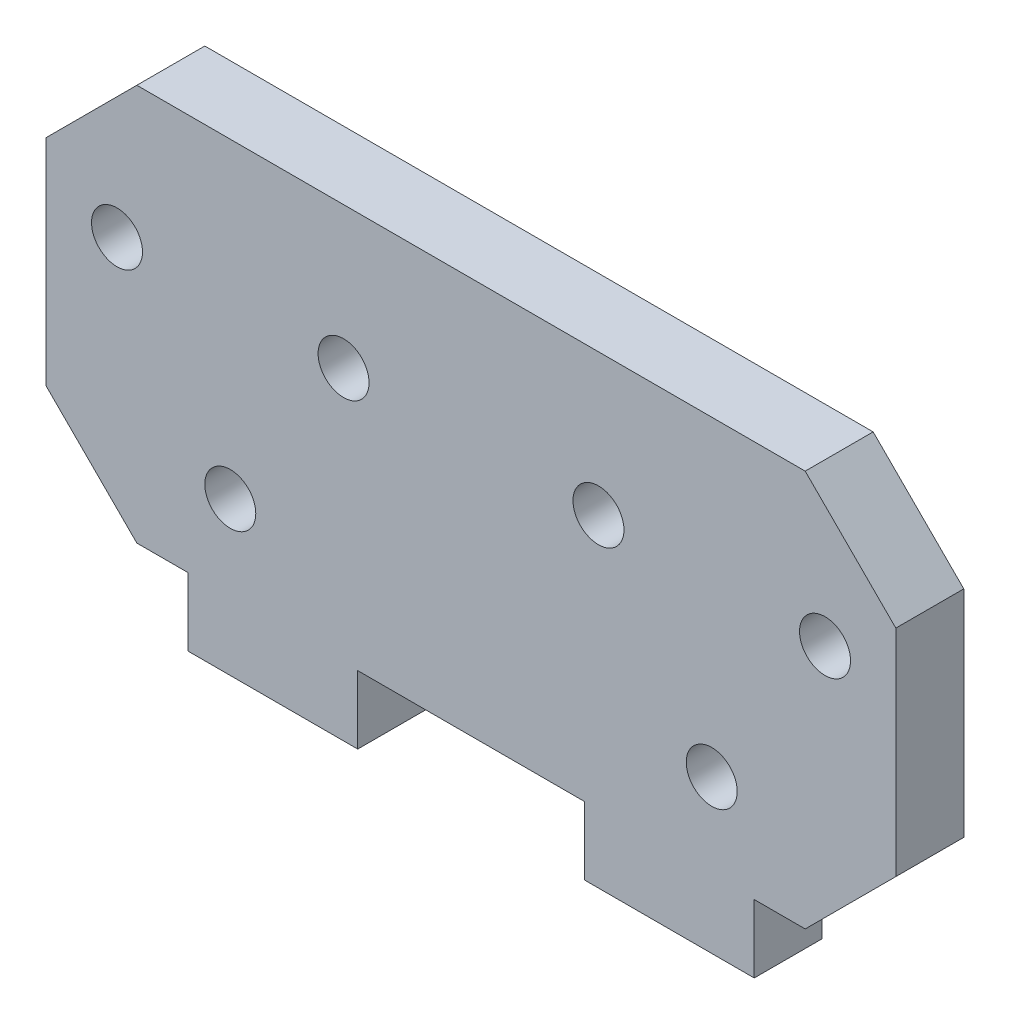
ISO-10303-21;
HEADER;
FILE_DESCRIPTION(('STEP AP214'),'2;1');
FILE_NAME('part.step','',(''),(''),'','','');
FILE_SCHEMA(('AUTOMOTIVE_DESIGN { 1 0 10303 214 1 1 1 1 }'));
ENDSEC;
DATA;
#1=APPLICATION_CONTEXT('core data for automotive mechanical design processes');
#2=APPLICATION_PROTOCOL_DEFINITION('international standard','automotive_design',2000,#1);
#3=PRODUCT_CONTEXT('',#1,'mechanical');
#4=PRODUCT('Part','Part','',(#3));
#5=PRODUCT_RELATED_PRODUCT_CATEGORY('part','',(#4));
#6=PRODUCT_DEFINITION_FORMATION('','',#4);
#7=PRODUCT_DEFINITION_CONTEXT('part definition',#1,'design');
#8=PRODUCT_DEFINITION('design','',#6,#7);
#9=PRODUCT_DEFINITION_SHAPE('','',#8);
#10=(LENGTH_UNIT() NAMED_UNIT(*) SI_UNIT(.MILLI.,.METRE.));
#11=(NAMED_UNIT(*) PLANE_ANGLE_UNIT() SI_UNIT($,.RADIAN.));
#12=(NAMED_UNIT(*) SI_UNIT($,.STERADIAN.) SOLID_ANGLE_UNIT());
#13=UNCERTAINTY_MEASURE_WITH_UNIT(LENGTH_MEASURE(1.E-05),#10,'distance_accuracy_value','');
#14=(GEOMETRIC_REPRESENTATION_CONTEXT(3) GLOBAL_UNCERTAINTY_ASSIGNED_CONTEXT((#13)) GLOBAL_UNIT_ASSIGNED_CONTEXT((#10,
#11,#12)) REPRESENTATION_CONTEXT('',''));
#15=CARTESIAN_POINT('',(0.,0.,0.));
#16=DIRECTION('',(0.,0.,1.));
#17=DIRECTION('',(1.,0.,0.));
#18=AXIS2_PLACEMENT_3D('',#15,#16,#17);
#19=CARTESIAN_POINT('',(-37.5,-17.5,3.));
#20=DIRECTION('',(0.,1.,0.));
#21=DIRECTION('',(-1.,0.,0.));
#22=AXIS2_PLACEMENT_3D('',#19,#20,#21);
#23=PLANE('',#22);
#24=DIRECTION('',(1.,0.,0.));
#25=VECTOR('',#24,1.);
#26=CARTESIAN_POINT('',(-37.5,-17.5,-3.));
#27=LINE('',#26,#25);
#28=CARTESIAN_POINT('',(-10.,-17.5,-3.));
#29=VERTEX_POINT('',#28);
#30=CARTESIAN_POINT('',(10.,-17.5,-3.));
#31=VERTEX_POINT('',#30);
#32=EDGE_CURVE('E269',#29,#31,#27,.T.);
#33=ORIENTED_EDGE('',*,*,#32,.T.);
#34=DIRECTION('',(0.,0.,1.));
#35=VECTOR('',#34,1.);
#36=CARTESIAN_POINT('',(10.,-17.5,-3.));
#37=LINE('',#36,#35);
#38=CARTESIAN_POINT('',(10.,-17.5,3.));
#39=VERTEX_POINT('',#38);
#40=EDGE_CURVE('E171',#31,#39,#37,.T.);
#41=ORIENTED_EDGE('',*,*,#40,.T.);
#42=DIRECTION('',(1.,0.,0.));
#43=VECTOR('',#42,1.);
#44=CARTESIAN_POINT('',(-37.5,-17.5,3.));
#45=LINE('',#44,#43);
#46=CARTESIAN_POINT('',(-10.,-17.5,3.));
#47=VERTEX_POINT('',#46);
#48=EDGE_CURVE('E256',#47,#39,#45,.T.);
#49=ORIENTED_EDGE('',*,*,#48,.F.);
#50=DIRECTION('',(0.,0.,1.));
#51=VECTOR('',#50,1.);
#52=CARTESIAN_POINT('',(-10.,-17.5,-3.));
#53=LINE('',#52,#51);
#54=EDGE_CURVE('E208',#29,#47,#53,.T.);
#55=ORIENTED_EDGE('',*,*,#54,.F.);
#56=EDGE_LOOP('',(#33,#41,#49,#55));
#57=FACE_BOUND('',#56,.T.);
#58=ADVANCED_FACE('F32',(#57),#23,.F.);
#59=CARTESIAN_POINT('',(25.,-17.5,-3.));
#60=VERTEX_POINT('',#59);
#61=CARTESIAN_POINT('',(29.5,-17.5,-3.));
#62=VERTEX_POINT('',#61);
#63=EDGE_CURVE('E265',#60,#62,#27,.T.);
#64=ORIENTED_EDGE('',*,*,#63,.T.);
#65=DIRECTION('',(0.,0.,1.));
#66=VECTOR('',#65,1.);
#67=CARTESIAN_POINT('',(29.5,-17.5,3.));
#68=LINE('',#67,#66);
#69=CARTESIAN_POINT('',(29.5,-17.5,3.));
#70=VERTEX_POINT('',#69);
#71=EDGE_CURVE('E47',#62,#70,#68,.T.);
#72=ORIENTED_EDGE('',*,*,#71,.T.);
#73=CARTESIAN_POINT('',(25.,-17.5,3.));
#74=VERTEX_POINT('',#73);
#75=EDGE_CURVE('E251',#74,#70,#45,.T.);
#76=ORIENTED_EDGE('',*,*,#75,.F.);
#77=DIRECTION('',(0.,0.,1.));
#78=VECTOR('',#77,1.);
#79=CARTESIAN_POINT('',(25.,-17.5,-3.));
#80=LINE('',#79,#78);
#81=EDGE_CURVE('E183',#60,#74,#80,.T.);
#82=ORIENTED_EDGE('',*,*,#81,.F.);
#83=EDGE_LOOP('',(#64,#72,#76,#82));
#84=FACE_BOUND('',#83,.T.);
#85=ADVANCED_FACE('F357',(#84),#23,.F.);
#86=CARTESIAN_POINT('',(0.,0.,3.));
#87=DIRECTION('',(0.,0.,1.));
#88=DIRECTION('',(1.,0.,0.));
#89=AXIS2_PLACEMENT_3D('',#86,#87,#88);
#90=PLANE('',#89);
#91=CARTESIAN_POINT('',(-31.25,5.,3.));
#92=DIRECTION('',(0.,0.,1.));
#93=DIRECTION('',(1.,0.,0.));
#94=AXIS2_PLACEMENT_3D('',#91,#92,#93);
#95=CIRCLE('',#94,2.24999999999999);
#96=CARTESIAN_POINT('',(-29.,5.,3.));
#97=VERTEX_POINT('',#96);
#98=EDGE_CURVE('E207',#97,#97,#95,.T.);
#99=ORIENTED_EDGE('',*,*,#98,.F.);
#100=EDGE_LOOP('',(#99));
#101=FACE_BOUND('',#100,.T.);
#102=CARTESIAN_POINT('',(31.25,5.,3.));
#103=DIRECTION('',(0.,0.,1.));
#104=DIRECTION('',(1.,0.,0.));
#105=AXIS2_PLACEMENT_3D('',#102,#103,#104);
#106=CIRCLE('',#105,2.24999999999999);
#107=CARTESIAN_POINT('',(33.5,5.,3.));
#108=VERTEX_POINT('',#107);
#109=EDGE_CURVE('E218',#108,#108,#106,.T.);
#110=ORIENTED_EDGE('',*,*,#109,.F.);
#111=EDGE_LOOP('',(#110));
#112=FACE_BOUND('',#111,.T.);
#113=CARTESIAN_POINT('',(11.25,5.,3.));
#114=DIRECTION('',(0.,0.,1.));
#115=DIRECTION('',(1.,0.,0.));
#116=AXIS2_PLACEMENT_3D('',#113,#114,#115);
#117=CIRCLE('',#116,2.24999999999999);
#118=CARTESIAN_POINT('',(13.5,5.,3.));
#119=VERTEX_POINT('',#118);
#120=EDGE_CURVE('E224',#119,#119,#117,.T.);
#121=ORIENTED_EDGE('',*,*,#120,.F.);
#122=EDGE_LOOP('',(#121));
#123=FACE_BOUND('',#122,.T.);
#124=CARTESIAN_POINT('',(-21.25,-10.,3.));
#125=DIRECTION('',(0.,0.,1.));
#126=DIRECTION('',(1.,0.,0.));
#127=AXIS2_PLACEMENT_3D('',#124,#125,#126);
#128=CIRCLE('',#127,2.24999999999999);
#129=CARTESIAN_POINT('',(-19.,-10.,3.));
#130=VERTEX_POINT('',#129);
#131=EDGE_CURVE('E230',#130,#130,#128,.T.);
#132=ORIENTED_EDGE('',*,*,#131,.F.);
#133=EDGE_LOOP('',(#132));
#134=FACE_BOUND('',#133,.T.);
#135=CARTESIAN_POINT('',(21.25,-10.,3.));
#136=DIRECTION('',(0.,0.,1.));
#137=DIRECTION('',(1.,0.,0.));
#138=AXIS2_PLACEMENT_3D('',#135,#136,#137);
#139=CIRCLE('',#138,2.24999999999999);
#140=CARTESIAN_POINT('',(23.5,-10.,3.));
#141=VERTEX_POINT('',#140);
#142=EDGE_CURVE('E236',#141,#141,#139,.T.);
#143=ORIENTED_EDGE('',*,*,#142,.F.);
#144=EDGE_LOOP('',(#143));
#145=FACE_BOUND('',#144,.T.);
#146=DIRECTION('',(0.,1.,0.));
#147=VECTOR('',#146,1.);
#148=CARTESIAN_POINT('',(37.5,17.5,3.));
#149=LINE('',#148,#147);
#150=CARTESIAN_POINT('',(37.5,-9.50000000000001,3.));
#151=VERTEX_POINT('',#150);
#152=CARTESIAN_POINT('',(37.5,9.49999999999997,3.));
#153=VERTEX_POINT('',#152);
#154=EDGE_CURVE('E255',#151,#153,#149,.T.);
#155=ORIENTED_EDGE('',*,*,#154,.T.);
#156=DIRECTION('',(0.707106781186546,-0.707106781186549,0.));
#157=VECTOR('',#156,1.);
#158=CARTESIAN_POINT('',(23.5000000000001,23.5,3.));
#159=LINE('',#158,#157);
#160=CARTESIAN_POINT('',(29.5,17.5,3.));
#161=VERTEX_POINT('',#160);
#162=EDGE_CURVE('E296',#153,#161,#159,.F.);
#163=ORIENTED_EDGE('',*,*,#162,.T.);
#164=DIRECTION('',(-1.,0.,0.));
#165=VECTOR('',#164,1.);
#166=CARTESIAN_POINT('',(-37.5,17.5,3.));
#167=LINE('',#166,#165);
#168=CARTESIAN_POINT('',(-29.5,17.5,3.));
#169=VERTEX_POINT('',#168);
#170=EDGE_CURVE('E259',#161,#169,#167,.T.);
#171=ORIENTED_EDGE('',*,*,#170,.T.);
#172=DIRECTION('',(0.707106781186549,0.707106781186546,0.));
#173=VECTOR('',#172,1.);
#174=CARTESIAN_POINT('',(-23.4999999999999,23.5,3.));
#175=LINE('',#174,#173);
#176=CARTESIAN_POINT('',(-37.5,9.50000000000001,3.));
#177=VERTEX_POINT('',#176);
#178=EDGE_CURVE('E291',#169,#177,#175,.F.);
#179=ORIENTED_EDGE('',*,*,#178,.T.);
#180=DIRECTION('',(0.,-1.,0.));
#181=VECTOR('',#180,1.);
#182=CARTESIAN_POINT('',(-37.5,17.5,3.));
#183=LINE('',#182,#181);
#184=CARTESIAN_POINT('',(-37.5,-9.49999999999999,3.));
#185=VERTEX_POINT('',#184);
#186=EDGE_CURVE('E249',#177,#185,#183,.T.);
#187=ORIENTED_EDGE('',*,*,#186,.T.);
#188=DIRECTION('',(-0.707106781186546,0.707106781186549,0.));
#189=VECTOR('',#188,1.);
#190=CARTESIAN_POINT('',(-23.5000000000001,-23.5,3.));
#191=LINE('',#190,#189);
#192=CARTESIAN_POINT('',(-29.5,-17.5,3.));
#193=VERTEX_POINT('',#192);
#194=EDGE_CURVE('E55',#185,#193,#191,.F.);
#195=ORIENTED_EDGE('',*,*,#194,.T.);
#196=CARTESIAN_POINT('',(-25.,-17.5,3.));
#197=VERTEX_POINT('',#196);
#198=EDGE_CURVE('E253',#193,#197,#45,.T.);
#199=ORIENTED_EDGE('',*,*,#198,.T.);
#200=DIRECTION('',(0.,-1.,0.));
#201=VECTOR('',#200,1.);
#202=CARTESIAN_POINT('',(-25.,-17.5,3.));
#203=LINE('',#202,#201);
#204=CARTESIAN_POINT('',(-25.,-23.5,3.));
#205=VERTEX_POINT('',#204);
#206=EDGE_CURVE('E182',#197,#205,#203,.T.);
#207=ORIENTED_EDGE('',*,*,#206,.T.);
#208=DIRECTION('',(1.,0.,0.));
#209=VECTOR('',#208,1.);
#210=CARTESIAN_POINT('',(-25.,-23.5,3.));
#211=LINE('',#210,#209);
#212=CARTESIAN_POINT('',(-10.,-23.5,3.));
#213=VERTEX_POINT('',#212);
#214=EDGE_CURVE('E199',#205,#213,#211,.T.);
#215=ORIENTED_EDGE('',*,*,#214,.T.);
#216=DIRECTION('',(0.,1.,0.));
#217=VECTOR('',#216,1.);
#218=CARTESIAN_POINT('',(-10.,-17.5,3.));
#219=LINE('',#218,#217);
#220=EDGE_CURVE('E191',#213,#47,#219,.T.);
#221=ORIENTED_EDGE('',*,*,#220,.T.);
#222=ORIENTED_EDGE('',*,*,#48,.T.);
#223=DIRECTION('',(0.,-1.,0.));
#224=VECTOR('',#223,1.);
#225=CARTESIAN_POINT('',(10.,-17.5,3.));
#226=LINE('',#225,#224);
#227=CARTESIAN_POINT('',(10.,-23.5,3.));
#228=VERTEX_POINT('',#227);
#229=EDGE_CURVE('E178',#39,#228,#226,.T.);
#230=ORIENTED_EDGE('',*,*,#229,.T.);
#231=DIRECTION('',(1.,0.,0.));
#232=VECTOR('',#231,1.);
#233=CARTESIAN_POINT('',(10.,-23.5,3.));
#234=LINE('',#233,#232);
#235=CARTESIAN_POINT('',(25.,-23.5,3.));
#236=VERTEX_POINT('',#235);
#237=EDGE_CURVE('E151',#228,#236,#234,.T.);
#238=ORIENTED_EDGE('',*,*,#237,.T.);
#239=DIRECTION('',(0.,1.,0.));
#240=VECTOR('',#239,1.);
#241=CARTESIAN_POINT('',(25.,-17.5,3.));
#242=LINE('',#241,#240);
#243=EDGE_CURVE('E172',#236,#74,#242,.T.);
#244=ORIENTED_EDGE('',*,*,#243,.T.);
#245=ORIENTED_EDGE('',*,*,#75,.T.);
#246=DIRECTION('',(-0.707106781186549,-0.707106781186546,0.));
#247=VECTOR('',#246,1.);
#248=CARTESIAN_POINT('',(23.4999999999999,-23.5,3.));
#249=LINE('',#248,#247);
#250=EDGE_CURVE('E294',#70,#151,#249,.F.);
#251=ORIENTED_EDGE('',*,*,#250,.T.);
#252=EDGE_LOOP('',(#155,#163,#171,#179,#187,#195,#199,#207,#215,#221,#222,#230,#238,#244,#245,#251));
#253=FACE_BOUND('',#252,.T.);
#254=CARTESIAN_POINT('',(-11.25,5.,3.));
#255=DIRECTION('',(0.,0.,1.));
#256=DIRECTION('',(1.,0.,0.));
#257=AXIS2_PLACEMENT_3D('',#254,#255,#256);
#258=CIRCLE('',#257,2.25);
#259=CARTESIAN_POINT('',(-9.,5.,3.));
#260=VERTEX_POINT('',#259);
#261=EDGE_CURVE('E243',#260,#260,#258,.T.);
#262=ORIENTED_EDGE('',*,*,#261,.F.);
#263=EDGE_LOOP('',(#262));
#264=FACE_BOUND('',#263,.T.);
#265=ADVANCED_FACE('F319',(#101,#112,#123,#134,#145,#253,#264),#90,.T.);
#266=CARTESIAN_POINT('',(0.,0.,-3.));
#267=DIRECTION('',(0.,0.,1.));
#268=DIRECTION('',(1.,0.,0.));
#269=AXIS2_PLACEMENT_3D('',#266,#267,#268);
#270=PLANE('',#269);
#271=CARTESIAN_POINT('',(-31.25,5.,-3.));
#272=DIRECTION('',(0.,0.,1.));
#273=DIRECTION('',(1.,0.,0.));
#274=AXIS2_PLACEMENT_3D('',#271,#272,#273);
#275=CIRCLE('',#274,2.24999999999999);
#276=CARTESIAN_POINT('',(-29.,5.,-3.));
#277=VERTEX_POINT('',#276);
#278=EDGE_CURVE('E215',#277,#277,#275,.T.);
#279=ORIENTED_EDGE('',*,*,#278,.T.);
#280=EDGE_LOOP('',(#279));
#281=FACE_BOUND('',#280,.T.);
#282=CARTESIAN_POINT('',(31.25,5.,-3.));
#283=DIRECTION('',(0.,0.,1.));
#284=DIRECTION('',(1.,0.,0.));
#285=AXIS2_PLACEMENT_3D('',#282,#283,#284);
#286=CIRCLE('',#285,2.25);
#287=CARTESIAN_POINT('',(33.5,5.,-3.));
#288=VERTEX_POINT('',#287);
#289=EDGE_CURVE('E221',#288,#288,#286,.T.);
#290=ORIENTED_EDGE('',*,*,#289,.T.);
#291=EDGE_LOOP('',(#290));
#292=FACE_BOUND('',#291,.T.);
#293=CARTESIAN_POINT('',(11.25,5.,-3.));
#294=DIRECTION('',(0.,0.,1.));
#295=DIRECTION('',(1.,0.,0.));
#296=AXIS2_PLACEMENT_3D('',#293,#294,#295);
#297=CIRCLE('',#296,2.24999999999999);
#298=CARTESIAN_POINT('',(13.5,5.,-3.));
#299=VERTEX_POINT('',#298);
#300=EDGE_CURVE('E227',#299,#299,#297,.T.);
#301=ORIENTED_EDGE('',*,*,#300,.T.);
#302=EDGE_LOOP('',(#301));
#303=FACE_BOUND('',#302,.T.);
#304=CARTESIAN_POINT('',(-21.25,-10.,-3.));
#305=DIRECTION('',(0.,0.,1.));
#306=DIRECTION('',(1.,0.,0.));
#307=AXIS2_PLACEMENT_3D('',#304,#305,#306);
#308=CIRCLE('',#307,2.24999999999999);
#309=CARTESIAN_POINT('',(-19.,-10.,-3.));
#310=VERTEX_POINT('',#309);
#311=EDGE_CURVE('E233',#310,#310,#308,.T.);
#312=ORIENTED_EDGE('',*,*,#311,.T.);
#313=EDGE_LOOP('',(#312));
#314=FACE_BOUND('',#313,.T.);
#315=CARTESIAN_POINT('',(21.25,-10.,-3.));
#316=DIRECTION('',(0.,0.,1.));
#317=DIRECTION('',(1.,0.,0.));
#318=AXIS2_PLACEMENT_3D('',#315,#316,#317);
#319=CIRCLE('',#318,2.24999999999999);
#320=CARTESIAN_POINT('',(23.5,-10.,-3.));
#321=VERTEX_POINT('',#320);
#322=EDGE_CURVE('E239',#321,#321,#319,.T.);
#323=ORIENTED_EDGE('',*,*,#322,.T.);
#324=EDGE_LOOP('',(#323));
#325=FACE_BOUND('',#324,.T.);
#326=DIRECTION('',(-1.,0.,0.));
#327=VECTOR('',#326,1.);
#328=CARTESIAN_POINT('',(-37.5,17.5,-3.));
#329=LINE('',#328,#327);
#330=CARTESIAN_POINT('',(29.5,17.5,-3.));
#331=VERTEX_POINT('',#330);
#332=CARTESIAN_POINT('',(-29.5,17.5,-3.));
#333=VERTEX_POINT('',#332);
#334=EDGE_CURVE('E252',#331,#333,#329,.T.);
#335=ORIENTED_EDGE('',*,*,#334,.F.);
#336=DIRECTION('',(-0.707106781186546,0.707106781186549,0.));
#337=VECTOR('',#336,1.);
#338=CARTESIAN_POINT('',(29.5,17.5,-3.));
#339=LINE('',#338,#337);
#340=CARTESIAN_POINT('',(37.5,9.49999999999997,-3.));
#341=VERTEX_POINT('',#340);
#342=EDGE_CURVE('E284',#331,#341,#339,.F.);
#343=ORIENTED_EDGE('',*,*,#342,.T.);
#344=DIRECTION('',(0.,1.,0.));
#345=VECTOR('',#344,1.);
#346=CARTESIAN_POINT('',(37.5,17.5,-3.));
#347=LINE('',#346,#345);
#348=CARTESIAN_POINT('',(37.5,-9.50000000000001,-3.));
#349=VERTEX_POINT('',#348);
#350=EDGE_CURVE('E268',#349,#341,#347,.T.);
#351=ORIENTED_EDGE('',*,*,#350,.F.);
#352=DIRECTION('',(0.707106781186549,0.707106781186546,0.));
#353=VECTOR('',#352,1.);
#354=CARTESIAN_POINT('',(37.5,-9.50000000000001,-3.));
#355=LINE('',#354,#353);
#356=EDGE_CURVE('E282',#349,#62,#355,.F.);
#357=ORIENTED_EDGE('',*,*,#356,.T.);
#358=ORIENTED_EDGE('',*,*,#63,.F.);
#359=DIRECTION('',(0.,1.,0.));
#360=VECTOR('',#359,1.);
#361=CARTESIAN_POINT('',(25.,-17.5,-3.));
#362=LINE('',#361,#360);
#363=CARTESIAN_POINT('',(25.,-23.5,-3.));
#364=VERTEX_POINT('',#363);
#365=EDGE_CURVE('E157',#364,#60,#362,.T.);
#366=ORIENTED_EDGE('',*,*,#365,.F.);
#367=DIRECTION('',(1.,0.,0.));
#368=VECTOR('',#367,1.);
#369=CARTESIAN_POINT('',(10.,-23.5,-3.));
#370=LINE('',#369,#368);
#371=CARTESIAN_POINT('',(10.,-23.5,-3.));
#372=VERTEX_POINT('',#371);
#373=EDGE_CURVE('E149',#372,#364,#370,.T.);
#374=ORIENTED_EDGE('',*,*,#373,.F.);
#375=DIRECTION('',(0.,-1.,0.));
#376=VECTOR('',#375,1.);
#377=CARTESIAN_POINT('',(10.,-17.5,-3.));
#378=LINE('',#377,#376);
#379=EDGE_CURVE('E166',#31,#372,#378,.T.);
#380=ORIENTED_EDGE('',*,*,#379,.F.);
#381=ORIENTED_EDGE('',*,*,#32,.F.);
#382=DIRECTION('',(0.,1.,0.));
#383=VECTOR('',#382,1.);
#384=CARTESIAN_POINT('',(-10.,-17.5,-3.));
#385=LINE('',#384,#383);
#386=CARTESIAN_POINT('',(-10.,-23.5,-3.));
#387=VERTEX_POINT('',#386);
#388=EDGE_CURVE('E194',#387,#29,#385,.T.);
#389=ORIENTED_EDGE('',*,*,#388,.F.);
#390=DIRECTION('',(1.,0.,0.));
#391=VECTOR('',#390,1.);
#392=CARTESIAN_POINT('',(-25.,-23.5,-3.));
#393=LINE('',#392,#391);
#394=CARTESIAN_POINT('',(-25.,-23.5,-3.));
#395=VERTEX_POINT('',#394);
#396=EDGE_CURVE('E190',#395,#387,#393,.T.);
#397=ORIENTED_EDGE('',*,*,#396,.F.);
#398=DIRECTION('',(0.,-1.,0.));
#399=VECTOR('',#398,1.);
#400=CARTESIAN_POINT('',(-25.,-17.5,-3.));
#401=LINE('',#400,#399);
#402=CARTESIAN_POINT('',(-25.,-17.5,-3.));
#403=VERTEX_POINT('',#402);
#404=EDGE_CURVE('E187',#403,#395,#401,.T.);
#405=ORIENTED_EDGE('',*,*,#404,.F.);
#406=CARTESIAN_POINT('',(-29.5,-17.5,-3.));
#407=VERTEX_POINT('',#406);
#408=EDGE_CURVE('E266',#407,#403,#27,.T.);
#409=ORIENTED_EDGE('',*,*,#408,.F.);
#410=DIRECTION('',(0.707106781186546,-0.707106781186549,0.));
#411=VECTOR('',#410,1.);
#412=CARTESIAN_POINT('',(-29.5,-17.5,-3.));
#413=LINE('',#412,#411);
#414=CARTESIAN_POINT('',(-37.5,-9.49999999999999,-3.));
#415=VERTEX_POINT('',#414);
#416=EDGE_CURVE('E280',#407,#415,#413,.F.);
#417=ORIENTED_EDGE('',*,*,#416,.T.);
#418=DIRECTION('',(0.,-1.,0.));
#419=VECTOR('',#418,1.);
#420=CARTESIAN_POINT('',(-37.5,17.5,-3.));
#421=LINE('',#420,#419);
#422=CARTESIAN_POINT('',(-37.5,9.50000000000001,-3.));
#423=VERTEX_POINT('',#422);
#424=EDGE_CURVE('E246',#423,#415,#421,.T.);
#425=ORIENTED_EDGE('',*,*,#424,.F.);
#426=DIRECTION('',(-0.707106781186549,-0.707106781186546,0.));
#427=VECTOR('',#426,1.);
#428=CARTESIAN_POINT('',(-37.5,9.50000000000001,-3.));
#429=LINE('',#428,#427);
#430=EDGE_CURVE('E278',#423,#333,#429,.F.);
#431=ORIENTED_EDGE('',*,*,#430,.T.);
#432=EDGE_LOOP('',(#335,#343,#351,#357,#358,#366,#374,#380,#381,#389,#397,#405,#409,#417,#425,#431));
#433=FACE_BOUND('',#432,.T.);
#434=CARTESIAN_POINT('',(-11.25,5.,-3.));
#435=DIRECTION('',(0.,0.,1.));
#436=DIRECTION('',(1.,0.,0.));
#437=AXIS2_PLACEMENT_3D('',#434,#435,#436);
#438=CIRCLE('',#437,2.25);
#439=CARTESIAN_POINT('',(-9.,5.,-3.));
#440=VERTEX_POINT('',#439);
#441=EDGE_CURVE('E242',#440,#440,#438,.T.);
#442=ORIENTED_EDGE('',*,*,#441,.T.);
#443=EDGE_LOOP('',(#442));
#444=FACE_BOUND('',#443,.T.);
#445=ADVANCED_FACE('F163',(#281,#292,#303,#314,#325,#433,#444),#270,.F.);
#446=CARTESIAN_POINT('',(-37.5,17.5,3.));
#447=DIRECTION('',(1.,0.,0.));
#448=DIRECTION('',(0.,0.,-1.));
#449=AXIS2_PLACEMENT_3D('',#446,#447,#448);
#450=PLANE('',#449);
#451=ORIENTED_EDGE('',*,*,#424,.T.);
#452=DIRECTION('',(0.,0.,1.));
#453=VECTOR('',#452,1.);
#454=CARTESIAN_POINT('',(-37.5,-9.49999999999999,3.));
#455=LINE('',#454,#453);
#456=EDGE_CURVE('E11',#415,#185,#455,.T.);
#457=ORIENTED_EDGE('',*,*,#456,.T.);
#458=ORIENTED_EDGE('',*,*,#186,.F.);
#459=DIRECTION('',(0.,0.,-1.));
#460=VECTOR('',#459,1.);
#461=CARTESIAN_POINT('',(-37.5,9.50000000000001,3.));
#462=LINE('',#461,#460);
#463=EDGE_CURVE('E40',#177,#423,#462,.T.);
#464=ORIENTED_EDGE('',*,*,#463,.T.);
#465=EDGE_LOOP('',(#451,#457,#458,#464));
#466=FACE_BOUND('',#465,.T.);
#467=ADVANCED_FACE('F306',(#466),#450,.F.);
#468=ORIENTED_EDGE('',*,*,#198,.F.);
#469=DIRECTION('',(0.,0.,-1.));
#470=VECTOR('',#469,1.);
#471=CARTESIAN_POINT('',(-29.5,-17.5,3.));
#472=LINE('',#471,#470);
#473=EDGE_CURVE('E299',#193,#407,#472,.T.);
#474=ORIENTED_EDGE('',*,*,#473,.T.);
#475=ORIENTED_EDGE('',*,*,#408,.T.);
#476=DIRECTION('',(0.,0.,1.));
#477=VECTOR('',#476,1.);
#478=CARTESIAN_POINT('',(-25.,-17.5,-3.));
#479=LINE('',#478,#477);
#480=EDGE_CURVE('E204',#403,#197,#479,.T.);
#481=ORIENTED_EDGE('',*,*,#480,.T.);
#482=EDGE_LOOP('',(#468,#474,#475,#481));
#483=FACE_BOUND('',#482,.T.);
#484=ADVANCED_FACE('F316',(#483),#23,.F.);
#485=CARTESIAN_POINT('',(37.5,17.5,3.));
#486=DIRECTION('',(-1.,0.,0.));
#487=DIRECTION('',(0.,0.,1.));
#488=AXIS2_PLACEMENT_3D('',#485,#486,#487);
#489=PLANE('',#488);
#490=ORIENTED_EDGE('',*,*,#350,.T.);
#491=DIRECTION('',(0.,0.,1.));
#492=VECTOR('',#491,1.);
#493=CARTESIAN_POINT('',(37.5,9.49999999999997,3.));
#494=LINE('',#493,#492);
#495=EDGE_CURVE('E289',#341,#153,#494,.T.);
#496=ORIENTED_EDGE('',*,*,#495,.T.);
#497=ORIENTED_EDGE('',*,*,#154,.F.);
#498=DIRECTION('',(0.,0.,-1.));
#499=VECTOR('',#498,1.);
#500=CARTESIAN_POINT('',(37.5,-9.50000000000001,3.));
#501=LINE('',#500,#499);
#502=EDGE_CURVE('E286',#151,#349,#501,.T.);
#503=ORIENTED_EDGE('',*,*,#502,.T.);
#504=EDGE_LOOP('',(#490,#496,#497,#503));
#505=FACE_BOUND('',#504,.T.);
#506=ADVANCED_FACE('F342',(#505),#489,.F.);
#507=CARTESIAN_POINT('',(-37.5,17.5,3.));
#508=DIRECTION('',(0.,-1.,0.));
#509=DIRECTION('',(1.,0.,0.));
#510=AXIS2_PLACEMENT_3D('',#507,#508,#509);
#511=PLANE('',#510);
#512=ORIENTED_EDGE('',*,*,#170,.F.);
#513=DIRECTION('',(0.,0.,-1.));
#514=VECTOR('',#513,1.);
#515=CARTESIAN_POINT('',(29.5,17.5,3.));
#516=LINE('',#515,#514);
#517=EDGE_CURVE('E275',#161,#331,#516,.T.);
#518=ORIENTED_EDGE('',*,*,#517,.T.);
#519=ORIENTED_EDGE('',*,*,#334,.T.);
#520=DIRECTION('',(0.,0.,1.));
#521=VECTOR('',#520,1.);
#522=CARTESIAN_POINT('',(-29.5,17.5,3.));
#523=LINE('',#522,#521);
#524=EDGE_CURVE('E262',#333,#169,#523,.T.);
#525=ORIENTED_EDGE('',*,*,#524,.T.);
#526=EDGE_LOOP('',(#512,#518,#519,#525));
#527=FACE_BOUND('',#526,.T.);
#528=ADVANCED_FACE('F350',(#527),#511,.F.);
#529=CARTESIAN_POINT('',(-11.25,5.,3.));
#530=DIRECTION('',(0.,0.,-1.));
#531=DIRECTION('',(-1.,0.,0.));
#532=AXIS2_PLACEMENT_3D('',#529,#530,#531);
#533=CYLINDRICAL_SURFACE('',#532,2.25);
#534=ORIENTED_EDGE('',*,*,#261,.T.);
#535=EDGE_LOOP('',(#534));
#536=FACE_BOUND('',#535,.T.);
#537=ORIENTED_EDGE('',*,*,#441,.F.);
#538=EDGE_LOOP('',(#537));
#539=FACE_BOUND('',#538,.T.);
#540=ADVANCED_FACE('F479',(#536,#539),#533,.F.);
#541=CARTESIAN_POINT('',(21.25,-10.,3.));
#542=DIRECTION('',(0.,0.,1.));
#543=DIRECTION('',(1.,0.,0.));
#544=AXIS2_PLACEMENT_3D('',#541,#542,#543);
#545=CYLINDRICAL_SURFACE('',#544,2.24999999999999);
#546=ORIENTED_EDGE('',*,*,#322,.F.);
#547=EDGE_LOOP('',(#546));
#548=FACE_BOUND('',#547,.T.);
#549=ORIENTED_EDGE('',*,*,#142,.T.);
#550=EDGE_LOOP('',(#549));
#551=FACE_BOUND('',#550,.T.);
#552=ADVANCED_FACE('F489',(#548,#551),#545,.F.);
#553=CARTESIAN_POINT('',(-21.25,-10.,3.));
#554=DIRECTION('',(0.,0.,1.));
#555=DIRECTION('',(1.,0.,0.));
#556=AXIS2_PLACEMENT_3D('',#553,#554,#555);
#557=CYLINDRICAL_SURFACE('',#556,2.24999999999999);
#558=ORIENTED_EDGE('',*,*,#311,.F.);
#559=EDGE_LOOP('',(#558));
#560=FACE_BOUND('',#559,.T.);
#561=ORIENTED_EDGE('',*,*,#131,.T.);
#562=EDGE_LOOP('',(#561));
#563=FACE_BOUND('',#562,.T.);
#564=ADVANCED_FACE('F496',(#560,#563),#557,.F.);
#565=CARTESIAN_POINT('',(11.25,5.,3.));
#566=DIRECTION('',(0.,0.,1.));
#567=DIRECTION('',(1.,0.,0.));
#568=AXIS2_PLACEMENT_3D('',#565,#566,#567);
#569=CYLINDRICAL_SURFACE('',#568,2.24999999999999);
#570=ORIENTED_EDGE('',*,*,#300,.F.);
#571=EDGE_LOOP('',(#570));
#572=FACE_BOUND('',#571,.T.);
#573=ORIENTED_EDGE('',*,*,#120,.T.);
#574=EDGE_LOOP('',(#573));
#575=FACE_BOUND('',#574,.T.);
#576=ADVANCED_FACE('F504',(#572,#575),#569,.F.);
#577=CARTESIAN_POINT('',(31.25,5.,3.));
#578=DIRECTION('',(0.,0.,1.));
#579=DIRECTION('',(1.,0.,0.));
#580=AXIS2_PLACEMENT_3D('',#577,#578,#579);
#581=CYLINDRICAL_SURFACE('',#580,2.25);
#582=ORIENTED_EDGE('',*,*,#289,.F.);
#583=EDGE_LOOP('',(#582));
#584=FACE_BOUND('',#583,.T.);
#585=ORIENTED_EDGE('',*,*,#109,.T.);
#586=EDGE_LOOP('',(#585));
#587=FACE_BOUND('',#586,.T.);
#588=ADVANCED_FACE('F512',(#584,#587),#581,.F.);
#589=CARTESIAN_POINT('',(-31.25,5.,3.));
#590=DIRECTION('',(0.,0.,1.));
#591=DIRECTION('',(1.,0.,0.));
#592=AXIS2_PLACEMENT_3D('',#589,#590,#591);
#593=CYLINDRICAL_SURFACE('',#592,2.24999999999999);
#594=ORIENTED_EDGE('',*,*,#278,.F.);
#595=EDGE_LOOP('',(#594));
#596=FACE_BOUND('',#595,.T.);
#597=ORIENTED_EDGE('',*,*,#98,.T.);
#598=EDGE_LOOP('',(#597));
#599=FACE_BOUND('',#598,.T.);
#600=ADVANCED_FACE('F446',(#596,#599),#593,.F.);
#601=CARTESIAN_POINT('',(-25.,-17.5,-3.));
#602=DIRECTION('',(-1.,0.,0.));
#603=DIRECTION('',(0.,0.,1.));
#604=AXIS2_PLACEMENT_3D('',#601,#602,#603);
#605=PLANE('',#604);
#606=ORIENTED_EDGE('',*,*,#206,.F.);
#607=ORIENTED_EDGE('',*,*,#480,.F.);
#608=ORIENTED_EDGE('',*,*,#404,.T.);
#609=DIRECTION('',(0.,0.,1.));
#610=VECTOR('',#609,1.);
#611=CARTESIAN_POINT('',(-25.,-23.5,-3.));
#612=LINE('',#611,#610);
#613=EDGE_CURVE('E196',#395,#205,#612,.T.);
#614=ORIENTED_EDGE('',*,*,#613,.T.);
#615=EDGE_LOOP('',(#606,#607,#608,#614));
#616=FACE_BOUND('',#615,.T.);
#617=ADVANCED_FACE('F322',(#616),#605,.T.);
#618=CARTESIAN_POINT('',(-10.,-17.5,-3.));
#619=DIRECTION('',(1.,0.,0.));
#620=DIRECTION('',(0.,0.,-1.));
#621=AXIS2_PLACEMENT_3D('',#618,#619,#620);
#622=PLANE('',#621);
#623=ORIENTED_EDGE('',*,*,#220,.F.);
#624=DIRECTION('',(0.,0.,1.));
#625=VECTOR('',#624,1.);
#626=CARTESIAN_POINT('',(-10.,-23.5,-3.));
#627=LINE('',#626,#625);
#628=EDGE_CURVE('E210',#387,#213,#627,.T.);
#629=ORIENTED_EDGE('',*,*,#628,.F.);
#630=ORIENTED_EDGE('',*,*,#388,.T.);
#631=ORIENTED_EDGE('',*,*,#54,.T.);
#632=EDGE_LOOP('',(#623,#629,#630,#631));
#633=FACE_BOUND('',#632,.T.);
#634=ADVANCED_FACE('F431',(#633),#622,.T.);
#635=CARTESIAN_POINT('',(-25.,-23.5,-3.));
#636=DIRECTION('',(0.,-1.,0.));
#637=DIRECTION('',(0.,0.,-1.));
#638=AXIS2_PLACEMENT_3D('',#635,#636,#637);
#639=PLANE('',#638);
#640=ORIENTED_EDGE('',*,*,#214,.F.);
#641=ORIENTED_EDGE('',*,*,#613,.F.);
#642=ORIENTED_EDGE('',*,*,#396,.T.);
#643=ORIENTED_EDGE('',*,*,#628,.T.);
#644=EDGE_LOOP('',(#640,#641,#642,#643));
#645=FACE_BOUND('',#644,.T.);
#646=ADVANCED_FACE('F326',(#645),#639,.T.);
#647=CARTESIAN_POINT('',(10.,-17.5,-3.));
#648=DIRECTION('',(-1.,0.,0.));
#649=DIRECTION('',(0.,0.,1.));
#650=AXIS2_PLACEMENT_3D('',#647,#648,#649);
#651=PLANE('',#650);
#652=ORIENTED_EDGE('',*,*,#229,.F.);
#653=ORIENTED_EDGE('',*,*,#40,.F.);
#654=ORIENTED_EDGE('',*,*,#379,.T.);
#655=DIRECTION('',(0.,0.,1.));
#656=VECTOR('',#655,1.);
#657=CARTESIAN_POINT('',(10.,-23.5,-3.));
#658=LINE('',#657,#656);
#659=EDGE_CURVE('E146',#372,#228,#658,.T.);
#660=ORIENTED_EDGE('',*,*,#659,.T.);
#661=EDGE_LOOP('',(#652,#653,#654,#660));
#662=FACE_BOUND('',#661,.T.);
#663=ADVANCED_FACE('F170',(#662),#651,.T.);
#664=CARTESIAN_POINT('',(25.,-17.5,-3.));
#665=DIRECTION('',(1.,0.,0.));
#666=DIRECTION('',(0.,0.,-1.));
#667=AXIS2_PLACEMENT_3D('',#664,#665,#666);
#668=PLANE('',#667);
#669=ORIENTED_EDGE('',*,*,#243,.F.);
#670=DIRECTION('',(0.,0.,1.));
#671=VECTOR('',#670,1.);
#672=CARTESIAN_POINT('',(25.,-23.5,-3.));
#673=LINE('',#672,#671);
#674=EDGE_CURVE('E156',#364,#236,#673,.T.);
#675=ORIENTED_EDGE('',*,*,#674,.F.);
#676=ORIENTED_EDGE('',*,*,#365,.T.);
#677=ORIENTED_EDGE('',*,*,#81,.T.);
#678=EDGE_LOOP('',(#669,#675,#676,#677));
#679=FACE_BOUND('',#678,.T.);
#680=ADVANCED_FACE('F407',(#679),#668,.T.);
#681=CARTESIAN_POINT('',(10.,-23.5,-3.));
#682=DIRECTION('',(0.,-1.,0.));
#683=DIRECTION('',(0.,0.,-1.));
#684=AXIS2_PLACEMENT_3D('',#681,#682,#683);
#685=PLANE('',#684);
#686=ORIENTED_EDGE('',*,*,#237,.F.);
#687=ORIENTED_EDGE('',*,*,#659,.F.);
#688=ORIENTED_EDGE('',*,*,#373,.T.);
#689=ORIENTED_EDGE('',*,*,#674,.T.);
#690=EDGE_LOOP('',(#686,#687,#688,#689));
#691=FACE_BOUND('',#690,.T.);
#692=ADVANCED_FACE('F148',(#691),#685,.T.);
#693=CARTESIAN_POINT('',(29.5,17.5,3.));
#694=DIRECTION('',(-0.707106781186549,-0.707106781186546,0.));
#695=DIRECTION('',(0.,0.,-1.));
#696=AXIS2_PLACEMENT_3D('',#693,#694,#695);
#697=PLANE('',#696);
#698=ORIENTED_EDGE('',*,*,#162,.F.);
#699=ORIENTED_EDGE('',*,*,#495,.F.);
#700=ORIENTED_EDGE('',*,*,#342,.F.);
#701=ORIENTED_EDGE('',*,*,#517,.F.);
#702=EDGE_LOOP('',(#698,#699,#700,#701));
#703=FACE_BOUND('',#702,.T.);
#704=ADVANCED_FACE('F347',(#703),#697,.F.);
#705=CARTESIAN_POINT('',(37.5,-9.50000000000001,3.));
#706=DIRECTION('',(-0.707106781186546,0.707106781186549,0.));
#707=DIRECTION('',(0.,0.,-1.));
#708=AXIS2_PLACEMENT_3D('',#705,#706,#707);
#709=PLANE('',#708);
#710=ORIENTED_EDGE('',*,*,#250,.F.);
#711=ORIENTED_EDGE('',*,*,#71,.F.);
#712=ORIENTED_EDGE('',*,*,#356,.F.);
#713=ORIENTED_EDGE('',*,*,#502,.F.);
#714=EDGE_LOOP('',(#710,#711,#712,#713));
#715=FACE_BOUND('',#714,.T.);
#716=ADVANCED_FACE('F339',(#715),#709,.F.);
#717=CARTESIAN_POINT('',(-29.5,-17.5,3.));
#718=DIRECTION('',(0.707106781186549,0.707106781186546,0.));
#719=DIRECTION('',(0.,0.,-1.));
#720=AXIS2_PLACEMENT_3D('',#717,#718,#719);
#721=PLANE('',#720);
#722=ORIENTED_EDGE('',*,*,#194,.F.);
#723=ORIENTED_EDGE('',*,*,#456,.F.);
#724=ORIENTED_EDGE('',*,*,#416,.F.);
#725=ORIENTED_EDGE('',*,*,#473,.F.);
#726=EDGE_LOOP('',(#722,#723,#724,#725));
#727=FACE_BOUND('',#726,.T.);
#728=ADVANCED_FACE('F314',(#727),#721,.F.);
#729=CARTESIAN_POINT('',(-37.5,9.50000000000001,3.));
#730=DIRECTION('',(0.707106781186546,-0.707106781186549,0.));
#731=DIRECTION('',(0.,0.,-1.));
#732=AXIS2_PLACEMENT_3D('',#729,#730,#731);
#733=PLANE('',#732);
#734=ORIENTED_EDGE('',*,*,#178,.F.);
#735=ORIENTED_EDGE('',*,*,#524,.F.);
#736=ORIENTED_EDGE('',*,*,#430,.F.);
#737=ORIENTED_EDGE('',*,*,#463,.F.);
#738=EDGE_LOOP('',(#734,#735,#736,#737));
#739=FACE_BOUND('',#738,.T.);
#740=ADVANCED_FACE('F34',(#739),#733,.F.);
#741=CLOSED_SHELL('',(#58,#85,#265,#445,#467,#484,#506,#528,#540,#552,#564,#576,#588,#600,#617,
#634,#646,#663,#680,#692,#704,#716,#728,#740));
#742=MANIFOLD_SOLID_BREP('B2',#741);
#743=ADVANCED_BREP_SHAPE_REPRESENTATION('',(#18,#742),#14);
#744=SHAPE_DEFINITION_REPRESENTATION(#9,#743);
ENDSEC;
END-ISO-10303-21;
